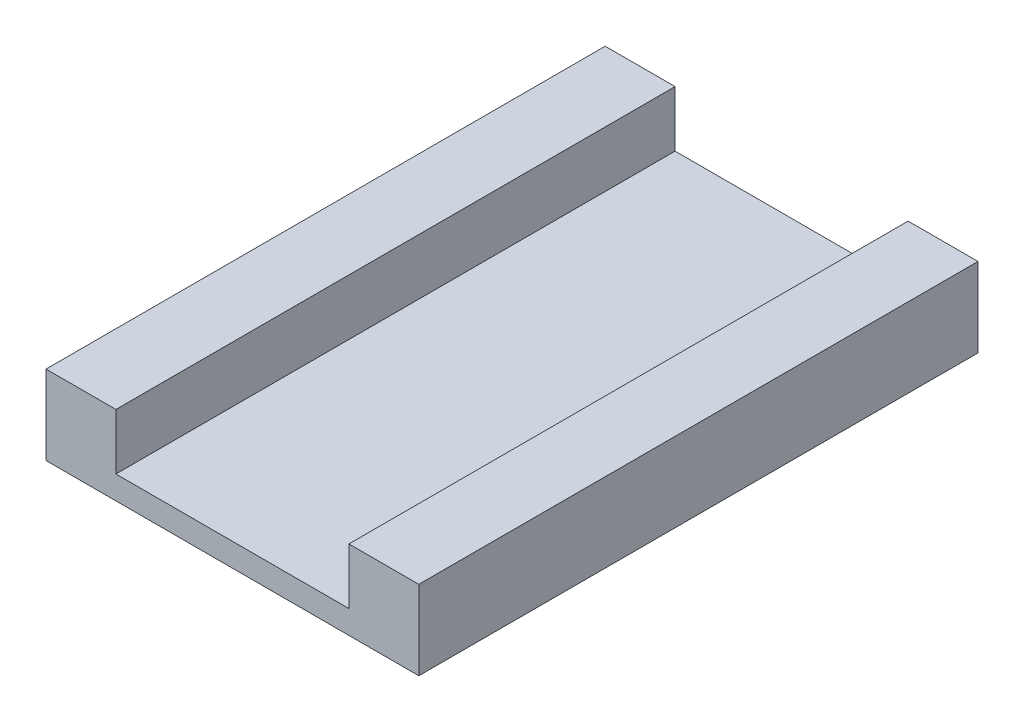
ISO-10303-21;
HEADER;
FILE_DESCRIPTION(('STEP AP214'),'2;1');
FILE_NAME('part.step','',(''),(''),'','','');
FILE_SCHEMA(('AUTOMOTIVE_DESIGN { 1 0 10303 214 1 1 1 1 }'));
ENDSEC;
DATA;
#1=APPLICATION_CONTEXT('core data for automotive mechanical design processes');
#2=APPLICATION_PROTOCOL_DEFINITION('international standard','automotive_design',2000,#1);
#3=PRODUCT_CONTEXT('',#1,'mechanical');
#4=PRODUCT('Part','Part','',(#3));
#5=PRODUCT_RELATED_PRODUCT_CATEGORY('part','',(#4));
#6=PRODUCT_DEFINITION_FORMATION('','',#4);
#7=PRODUCT_DEFINITION_CONTEXT('part definition',#1,'design');
#8=PRODUCT_DEFINITION('design','',#6,#7);
#9=PRODUCT_DEFINITION_SHAPE('','',#8);
#10=(LENGTH_UNIT() NAMED_UNIT(*) SI_UNIT(.MILLI.,.METRE.));
#11=(NAMED_UNIT(*) PLANE_ANGLE_UNIT() SI_UNIT($,.RADIAN.));
#12=(NAMED_UNIT(*) SI_UNIT($,.STERADIAN.) SOLID_ANGLE_UNIT());
#13=UNCERTAINTY_MEASURE_WITH_UNIT(LENGTH_MEASURE(1.E-05),#10,'distance_accuracy_value','');
#14=(GEOMETRIC_REPRESENTATION_CONTEXT(3) GLOBAL_UNCERTAINTY_ASSIGNED_CONTEXT((#13)) GLOBAL_UNIT_ASSIGNED_CONTEXT((#10,
#11,#12)) REPRESENTATION_CONTEXT('',''));
#15=CARTESIAN_POINT('',(0.,0.,0.));
#16=DIRECTION('',(0.,0.,1.));
#17=DIRECTION('',(1.,0.,0.));
#18=AXIS2_PLACEMENT_3D('',#15,#16,#17);
#19=CARTESIAN_POINT('',(0.,8.5,0.));
#20=DIRECTION('',(0.,-1.,0.));
#21=DIRECTION('',(0.,0.,-1.));
#22=AXIS2_PLACEMENT_3D('',#19,#20,#21);
#23=PLANE('',#22);
#24=DIRECTION('',(1.,0.,0.));
#25=VECTOR('',#24,1.);
#26=CARTESIAN_POINT('',(0.,8.5,0.));
#27=LINE('',#26,#25);
#28=CARTESIAN_POINT('',(0.,8.5,0.));
#29=VERTEX_POINT('',#28);
#30=CARTESIAN_POINT('',(7.5,8.5,0.));
#31=VERTEX_POINT('',#30);
#32=EDGE_CURVE('E86',#29,#31,#27,.T.);
#33=ORIENTED_EDGE('',*,*,#32,.T.);
#34=DIRECTION('',(0.,0.,1.));
#35=VECTOR('',#34,1.);
#36=CARTESIAN_POINT('',(7.5,8.5,-60.));
#37=LINE('',#36,#35);
#38=CARTESIAN_POINT('',(7.5,8.5,-60.));
#39=VERTEX_POINT('',#38);
#40=EDGE_CURVE('E112',#39,#31,#37,.T.);
#41=ORIENTED_EDGE('',*,*,#40,.F.);
#42=DIRECTION('',(-1.,0.,0.));
#43=VECTOR('',#42,1.);
#44=CARTESIAN_POINT('',(0.,8.5,-60.));
#45=LINE('',#44,#43);
#46=CARTESIAN_POINT('',(0.,8.5,-60.));
#47=VERTEX_POINT('',#46);
#48=EDGE_CURVE('E57',#39,#47,#45,.T.);
#49=ORIENTED_EDGE('',*,*,#48,.T.);
#50=DIRECTION('',(0.,0.,1.));
#51=VECTOR('',#50,1.);
#52=CARTESIAN_POINT('',(0.,8.5,0.));
#53=LINE('',#52,#51);
#54=EDGE_CURVE('E141',#47,#29,#53,.T.);
#55=ORIENTED_EDGE('',*,*,#54,.T.);
#56=EDGE_LOOP('',(#33,#41,#49,#55));
#57=FACE_BOUND('',#56,.T.);
#58=ADVANCED_FACE('F33',(#57),#23,.F.);
#59=CARTESIAN_POINT('',(0.,8.5,0.));
#60=DIRECTION('',(1.,0.,0.));
#61=DIRECTION('',(0.,0.,-1.));
#62=AXIS2_PLACEMENT_3D('',#59,#60,#61);
#63=PLANE('',#62);
#64=DIRECTION('',(0.,0.,1.));
#65=VECTOR('',#64,1.);
#66=CARTESIAN_POINT('',(0.,0.,0.));
#67=LINE('',#66,#65);
#68=CARTESIAN_POINT('',(0.,0.,-60.));
#69=VERTEX_POINT('',#68);
#70=CARTESIAN_POINT('',(0.,0.,0.));
#71=VERTEX_POINT('',#70);
#72=EDGE_CURVE('E136',#69,#71,#67,.T.);
#73=ORIENTED_EDGE('',*,*,#72,.T.);
#74=DIRECTION('',(0.,-1.,0.));
#75=VECTOR('',#74,1.);
#76=CARTESIAN_POINT('',(0.,8.5,0.));
#77=LINE('',#76,#75);
#78=EDGE_CURVE('E11',#29,#71,#77,.T.);
#79=ORIENTED_EDGE('',*,*,#78,.F.);
#80=ORIENTED_EDGE('',*,*,#54,.F.);
#81=DIRECTION('',(0.,-1.,0.));
#82=VECTOR('',#81,1.);
#83=CARTESIAN_POINT('',(0.,8.5,-60.));
#84=LINE('',#83,#82);
#85=EDGE_CURVE('E150',#47,#69,#84,.T.);
#86=ORIENTED_EDGE('',*,*,#85,.T.);
#87=EDGE_LOOP('',(#73,#79,#80,#86));
#88=FACE_BOUND('',#87,.T.);
#89=ADVANCED_FACE('F35',(#88),#63,.F.);
#90=CARTESIAN_POINT('',(0.,8.5,0.));
#91=DIRECTION('',(0.,0.,-1.));
#92=DIRECTION('',(-1.,0.,0.));
#93=AXIS2_PLACEMENT_3D('',#90,#91,#92);
#94=PLANE('',#93);
#95=DIRECTION('',(1.,0.,0.));
#96=VECTOR('',#95,1.);
#97=CARTESIAN_POINT('',(7.5,2.5,0.));
#98=LINE('',#97,#96);
#99=CARTESIAN_POINT('',(7.5,2.5,0.));
#100=VERTEX_POINT('',#99);
#101=CARTESIAN_POINT('',(32.5,2.5,0.));
#102=VERTEX_POINT('',#101);
#103=EDGE_CURVE('E120',#100,#102,#98,.T.);
#104=ORIENTED_EDGE('',*,*,#103,.F.);
#105=DIRECTION('',(0.,1.,0.));
#106=VECTOR('',#105,1.);
#107=CARTESIAN_POINT('',(7.5,2.5,0.));
#108=LINE('',#107,#106);
#109=EDGE_CURVE('E107',#100,#31,#108,.T.);
#110=ORIENTED_EDGE('',*,*,#109,.T.);
#111=ORIENTED_EDGE('',*,*,#32,.F.);
#112=ORIENTED_EDGE('',*,*,#78,.T.);
#113=DIRECTION('',(1.,0.,0.));
#114=VECTOR('',#113,1.);
#115=CARTESIAN_POINT('',(0.,0.,0.));
#116=LINE('',#115,#114);
#117=CARTESIAN_POINT('',(40.,0.,0.));
#118=VERTEX_POINT('',#117);
#119=EDGE_CURVE('E153',#71,#118,#116,.T.);
#120=ORIENTED_EDGE('',*,*,#119,.T.);
#121=DIRECTION('',(0.,-1.,0.));
#122=VECTOR('',#121,1.);
#123=CARTESIAN_POINT('',(40.,8.5,0.));
#124=LINE('',#123,#122);
#125=CARTESIAN_POINT('',(40.,8.5,0.));
#126=VERTEX_POINT('',#125);
#127=EDGE_CURVE('E41',#126,#118,#124,.T.);
#128=ORIENTED_EDGE('',*,*,#127,.F.);
#129=CARTESIAN_POINT('',(32.5,8.5,0.));
#130=VERTEX_POINT('',#129);
#131=EDGE_CURVE('E143',#130,#126,#27,.T.);
#132=ORIENTED_EDGE('',*,*,#131,.F.);
#133=DIRECTION('',(0.,1.,0.));
#134=VECTOR('',#133,1.);
#135=CARTESIAN_POINT('',(32.5,2.5,0.));
#136=LINE('',#135,#134);
#137=EDGE_CURVE('E48',#102,#130,#136,.T.);
#138=ORIENTED_EDGE('',*,*,#137,.F.);
#139=EDGE_LOOP('',(#104,#110,#111,#112,#120,#128,#132,#138));
#140=FACE_BOUND('',#139,.T.);
#141=ADVANCED_FACE('F125',(#140),#94,.F.);
#142=CARTESIAN_POINT('',(40.,8.5,0.));
#143=DIRECTION('',(-1.,0.,0.));
#144=DIRECTION('',(0.,0.,1.));
#145=AXIS2_PLACEMENT_3D('',#142,#143,#144);
#146=PLANE('',#145);
#147=DIRECTION('',(0.,0.,-1.));
#148=VECTOR('',#147,1.);
#149=CARTESIAN_POINT('',(40.,0.,0.));
#150=LINE('',#149,#148);
#151=CARTESIAN_POINT('',(40.,0.,-60.));
#152=VERTEX_POINT('',#151);
#153=EDGE_CURVE('E155',#118,#152,#150,.T.);
#154=ORIENTED_EDGE('',*,*,#153,.T.);
#155=DIRECTION('',(0.,-1.,0.));
#156=VECTOR('',#155,1.);
#157=CARTESIAN_POINT('',(40.,8.5,-60.));
#158=LINE('',#157,#156);
#159=CARTESIAN_POINT('',(40.,8.5,-60.));
#160=VERTEX_POINT('',#159);
#161=EDGE_CURVE('E159',#160,#152,#158,.T.);
#162=ORIENTED_EDGE('',*,*,#161,.F.);
#163=DIRECTION('',(0.,0.,-1.));
#164=VECTOR('',#163,1.);
#165=CARTESIAN_POINT('',(40.,8.5,0.));
#166=LINE('',#165,#164);
#167=EDGE_CURVE('E145',#126,#160,#166,.T.);
#168=ORIENTED_EDGE('',*,*,#167,.F.);
#169=ORIENTED_EDGE('',*,*,#127,.T.);
#170=EDGE_LOOP('',(#154,#162,#168,#169));
#171=FACE_BOUND('',#170,.T.);
#172=ADVANCED_FACE('F165',(#171),#146,.F.);
#173=CARTESIAN_POINT('',(0.,8.5,-60.));
#174=DIRECTION('',(0.,0.,1.));
#175=DIRECTION('',(1.,0.,0.));
#176=AXIS2_PLACEMENT_3D('',#173,#174,#175);
#177=PLANE('',#176);
#178=ORIENTED_EDGE('',*,*,#48,.F.);
#179=DIRECTION('',(0.,1.,0.));
#180=VECTOR('',#179,1.);
#181=CARTESIAN_POINT('',(7.5,2.5,-60.));
#182=LINE('',#181,#180);
#183=CARTESIAN_POINT('',(7.5,2.5,-60.));
#184=VERTEX_POINT('',#183);
#185=EDGE_CURVE('E134',#184,#39,#182,.T.);
#186=ORIENTED_EDGE('',*,*,#185,.F.);
#187=DIRECTION('',(-1.,0.,0.));
#188=VECTOR('',#187,1.);
#189=CARTESIAN_POINT('',(7.5,2.5,-60.));
#190=LINE('',#189,#188);
#191=CARTESIAN_POINT('',(32.5,2.5,-60.));
#192=VERTEX_POINT('',#191);
#193=EDGE_CURVE('E114',#192,#184,#190,.T.);
#194=ORIENTED_EDGE('',*,*,#193,.F.);
#195=DIRECTION('',(0.,1.,0.));
#196=VECTOR('',#195,1.);
#197=CARTESIAN_POINT('',(32.5,2.5,-60.));
#198=LINE('',#197,#196);
#199=CARTESIAN_POINT('',(32.5,8.5,-60.));
#200=VERTEX_POINT('',#199);
#201=EDGE_CURVE('E137',#192,#200,#198,.T.);
#202=ORIENTED_EDGE('',*,*,#201,.T.);
#203=EDGE_CURVE('E147',#160,#200,#45,.T.);
#204=ORIENTED_EDGE('',*,*,#203,.F.);
#205=ORIENTED_EDGE('',*,*,#161,.T.);
#206=DIRECTION('',(-1.,0.,0.));
#207=VECTOR('',#206,1.);
#208=CARTESIAN_POINT('',(0.,0.,-60.));
#209=LINE('',#208,#207);
#210=EDGE_CURVE('E79',#152,#69,#209,.T.);
#211=ORIENTED_EDGE('',*,*,#210,.T.);
#212=ORIENTED_EDGE('',*,*,#85,.F.);
#213=EDGE_LOOP('',(#178,#186,#194,#202,#204,#205,#211,#212));
#214=FACE_BOUND('',#213,.T.);
#215=ADVANCED_FACE('F173',(#214),#177,.F.);
#216=ORIENTED_EDGE('',*,*,#203,.T.);
#217=DIRECTION('',(0.,0.,-1.));
#218=VECTOR('',#217,1.);
#219=CARTESIAN_POINT('',(32.5,8.5,-60.));
#220=LINE('',#219,#218);
#221=EDGE_CURVE('E123',#130,#200,#220,.T.);
#222=ORIENTED_EDGE('',*,*,#221,.F.);
#223=ORIENTED_EDGE('',*,*,#131,.T.);
#224=ORIENTED_EDGE('',*,*,#167,.T.);
#225=EDGE_LOOP('',(#216,#222,#223,#224));
#226=FACE_BOUND('',#225,.T.);
#227=ADVANCED_FACE('F176',(#226),#23,.F.);
#228=CARTESIAN_POINT('',(0.,0.,0.));
#229=DIRECTION('',(0.,-1.,0.));
#230=DIRECTION('',(0.,0.,-1.));
#231=AXIS2_PLACEMENT_3D('',#228,#229,#230);
#232=PLANE('',#231);
#233=ORIENTED_EDGE('',*,*,#72,.F.);
#234=ORIENTED_EDGE('',*,*,#210,.F.);
#235=ORIENTED_EDGE('',*,*,#153,.F.);
#236=ORIENTED_EDGE('',*,*,#119,.F.);
#237=EDGE_LOOP('',(#233,#234,#235,#236));
#238=FACE_BOUND('',#237,.T.);
#239=ADVANCED_FACE('F169',(#238),#232,.T.);
#240=CARTESIAN_POINT('',(7.5,2.5,-60.));
#241=DIRECTION('',(-1.,0.,0.));
#242=DIRECTION('',(0.,0.,1.));
#243=AXIS2_PLACEMENT_3D('',#240,#241,#242);
#244=PLANE('',#243);
#245=ORIENTED_EDGE('',*,*,#40,.T.);
#246=ORIENTED_EDGE('',*,*,#109,.F.);
#247=DIRECTION('',(0.,0.,1.));
#248=VECTOR('',#247,1.);
#249=CARTESIAN_POINT('',(7.5,2.5,-60.));
#250=LINE('',#249,#248);
#251=EDGE_CURVE('E110',#184,#100,#250,.T.);
#252=ORIENTED_EDGE('',*,*,#251,.F.);
#253=ORIENTED_EDGE('',*,*,#185,.T.);
#254=EDGE_LOOP('',(#245,#246,#252,#253));
#255=FACE_BOUND('',#254,.T.);
#256=ADVANCED_FACE('F109',(#255),#244,.F.);
#257=CARTESIAN_POINT('',(32.5,2.5,-60.));
#258=DIRECTION('',(1.,0.,0.));
#259=DIRECTION('',(0.,0.,-1.));
#260=AXIS2_PLACEMENT_3D('',#257,#258,#259);
#261=PLANE('',#260);
#262=ORIENTED_EDGE('',*,*,#221,.T.);
#263=ORIENTED_EDGE('',*,*,#201,.F.);
#264=DIRECTION('',(0.,0.,-1.));
#265=VECTOR('',#264,1.);
#266=CARTESIAN_POINT('',(32.5,2.5,-60.));
#267=LINE('',#266,#265);
#268=EDGE_CURVE('E127',#102,#192,#267,.T.);
#269=ORIENTED_EDGE('',*,*,#268,.F.);
#270=ORIENTED_EDGE('',*,*,#137,.T.);
#271=EDGE_LOOP('',(#262,#263,#269,#270));
#272=FACE_BOUND('',#271,.T.);
#273=ADVANCED_FACE('F190',(#272),#261,.F.);
#274=CARTESIAN_POINT('',(0.,2.5,0.));
#275=DIRECTION('',(0.,1.,0.));
#276=DIRECTION('',(0.,0.,1.));
#277=AXIS2_PLACEMENT_3D('',#274,#275,#276);
#278=PLANE('',#277);
#279=ORIENTED_EDGE('',*,*,#251,.T.);
#280=ORIENTED_EDGE('',*,*,#103,.T.);
#281=ORIENTED_EDGE('',*,*,#268,.T.);
#282=ORIENTED_EDGE('',*,*,#193,.T.);
#283=EDGE_LOOP('',(#279,#280,#281,#282));
#284=FACE_BOUND('',#283,.T.);
#285=ADVANCED_FACE('F118',(#284),#278,.T.);
#286=CLOSED_SHELL('',(#58,#89,#141,#172,#215,#227,#239,#256,#273,#285));
#287=MANIFOLD_SOLID_BREP('B2',#286);
#288=ADVANCED_BREP_SHAPE_REPRESENTATION('',(#18,#287),#14);
#289=SHAPE_DEFINITION_REPRESENTATION(#9,#288);
ENDSEC;
END-ISO-10303-21;
